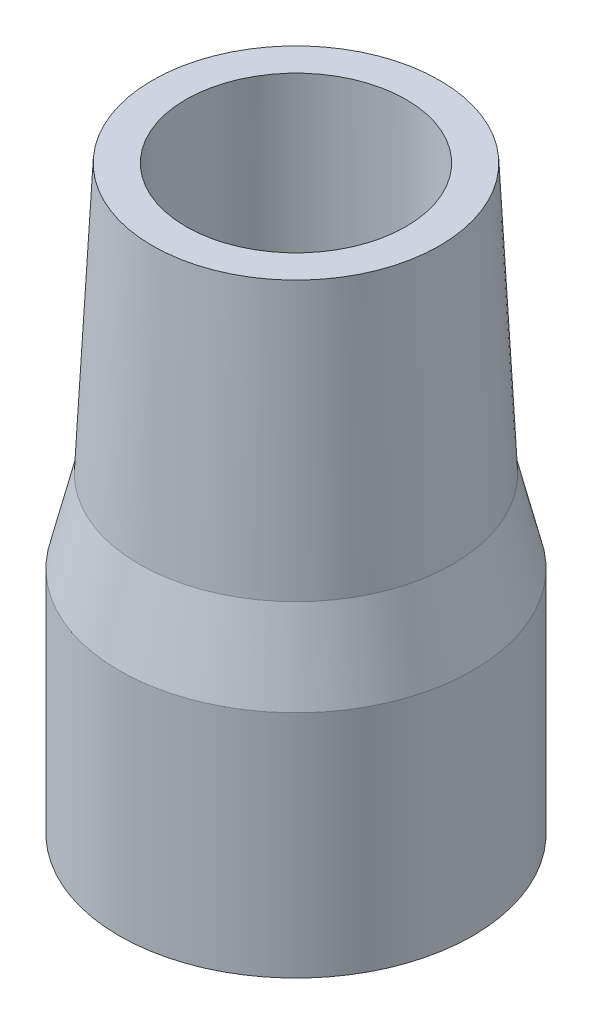
ISO-10303-21;
HEADER;
FILE_DESCRIPTION(('STEP AP214'),'2;1');
FILE_NAME('part.step','',(''),(''),'','','');
FILE_SCHEMA(('AUTOMOTIVE_DESIGN { 1 0 10303 214 1 1 1 1 }'));
ENDSEC;
DATA;
#1=APPLICATION_CONTEXT('core data for automotive mechanical design processes');
#2=APPLICATION_PROTOCOL_DEFINITION('international standard','automotive_design',2000,#1);
#3=PRODUCT_CONTEXT('',#1,'mechanical');
#4=PRODUCT('Part','Part','',(#3));
#5=PRODUCT_RELATED_PRODUCT_CATEGORY('part','',(#4));
#6=PRODUCT_DEFINITION_FORMATION('','',#4);
#7=PRODUCT_DEFINITION_CONTEXT('part definition',#1,'design');
#8=PRODUCT_DEFINITION('design','',#6,#7);
#9=PRODUCT_DEFINITION_SHAPE('','',#8);
#10=(LENGTH_UNIT() NAMED_UNIT(*) SI_UNIT(.MILLI.,.METRE.));
#11=(NAMED_UNIT(*) PLANE_ANGLE_UNIT() SI_UNIT($,.RADIAN.));
#12=(NAMED_UNIT(*) SI_UNIT($,.STERADIAN.) SOLID_ANGLE_UNIT());
#13=UNCERTAINTY_MEASURE_WITH_UNIT(LENGTH_MEASURE(1.E-05),#10,'distance_accuracy_value','');
#14=(GEOMETRIC_REPRESENTATION_CONTEXT(3) GLOBAL_UNCERTAINTY_ASSIGNED_CONTEXT((#13)) GLOBAL_UNIT_ASSIGNED_CONTEXT((#10,
#11,#12)) REPRESENTATION_CONTEXT('',''));
#15=CARTESIAN_POINT('',(0.,0.,0.));
#16=DIRECTION('',(0.,0.,1.));
#17=DIRECTION('',(1.,0.,0.));
#18=AXIS2_PLACEMENT_3D('',#15,#16,#17);
#19=CARTESIAN_POINT('',(10.25,-16.7188621181585,0.));
#20=DIRECTION('',(0.,-1.,0.));
#21=DIRECTION('',(0.,0.,-1.));
#22=AXIS2_PLACEMENT_3D('',#19,#20,#21);
#23=PLANE('',#22);
#24=CARTESIAN_POINT('',(0.,-16.7188621181585,0.));
#25=DIRECTION('',(0.,-1.,0.));
#26=DIRECTION('',(0.,0.,-1.));
#27=AXIS2_PLACEMENT_3D('',#24,#25,#26);
#28=CIRCLE('',#27,13.25);
#29=CARTESIAN_POINT('',(0.,-16.7188621181585,-13.25));
#30=VERTEX_POINT('',#29);
#31=EDGE_CURVE('E10',#30,#30,#28,.T.);
#32=ORIENTED_EDGE('',*,*,#31,.T.);
#33=EDGE_LOOP('',(#32));
#34=FACE_BOUND('',#33,.T.);
#35=CARTESIAN_POINT('',(0.,-16.7188621181585,0.));
#36=DIRECTION('',(0.,-1.,0.));
#37=DIRECTION('',(0.,0.,-1.));
#38=AXIS2_PLACEMENT_3D('',#35,#36,#37);
#39=CIRCLE('',#38,10.25);
#40=CARTESIAN_POINT('',(0.,-16.7188621181585,-10.25));
#41=VERTEX_POINT('',#40);
#42=EDGE_CURVE('E65',#41,#41,#39,.T.);
#43=ORIENTED_EDGE('',*,*,#42,.F.);
#44=EDGE_LOOP('',(#43));
#45=FACE_BOUND('',#44,.T.);
#46=ADVANCED_FACE('F31',(#34,#45),#23,.T.);
#47=CARTESIAN_POINT('',(0.,0.,0.));
#48=DIRECTION('',(0.,-1.,0.));
#49=DIRECTION('',(0.,0.,-1.));
#50=AXIS2_PLACEMENT_3D('',#47,#48,#49);
#51=CYLINDRICAL_SURFACE('',#50,13.25);
#52=CARTESIAN_POINT('',(0.,0.499962164423475,0.));
#53=DIRECTION('',(0.,-1.,0.));
#54=DIRECTION('',(0.,0.,-1.));
#55=AXIS2_PLACEMENT_3D('',#52,#53,#54);
#56=CIRCLE('',#55,13.25);
#57=CARTESIAN_POINT('',(0.,0.499962164423475,-13.25));
#58=VERTEX_POINT('',#57);
#59=EDGE_CURVE('E37',#58,#58,#56,.T.);
#60=ORIENTED_EDGE('',*,*,#59,.T.);
#61=EDGE_LOOP('',(#60));
#62=FACE_BOUND('',#61,.T.);
#63=ORIENTED_EDGE('',*,*,#31,.F.);
#64=EDGE_LOOP('',(#63));
#65=FACE_BOUND('',#64,.T.);
#66=ADVANCED_FACE('F73',(#62,#65),#51,.T.);
#67=CARTESIAN_POINT('',(0.,0.499962164423475,0.));
#68=DIRECTION('',(0.,-1.,0.));
#69=DIRECTION('',(0.,0.,-1.));
#70=AXIS2_PLACEMENT_3D('',#67,#68,#69);
#71=CONICAL_SURFACE('',#70,13.25,0.239358919330739);
#72=CARTESIAN_POINT('',(0.,6.6465626021171,0.));
#73=DIRECTION('',(0.,-1.,0.));
#74=DIRECTION('',(0.,0.,-1.));
#75=AXIS2_PLACEMENT_3D('',#72,#73,#74);
#76=CIRCLE('',#75,11.75);
#77=CARTESIAN_POINT('',(0.,6.6465626021171,-11.75));
#78=VERTEX_POINT('',#77);
#79=EDGE_CURVE('E41',#78,#78,#76,.T.);
#80=ORIENTED_EDGE('',*,*,#79,.T.);
#81=EDGE_LOOP('',(#80));
#82=FACE_BOUND('',#81,.T.);
#83=ORIENTED_EDGE('',*,*,#59,.F.);
#84=EDGE_LOOP('',(#83));
#85=FACE_BOUND('',#84,.T.);
#86=ADVANCED_FACE('F77',(#82,#85),#71,.T.);
#87=CARTESIAN_POINT('',(0.,6.6465626021171,0.));
#88=DIRECTION('',(0.,-1.,0.));
#89=DIRECTION('',(0.,0.,-1.));
#90=AXIS2_PLACEMENT_3D('',#87,#88,#89);
#91=CONICAL_SURFACE('',#90,11.75,0.0495574990959468);
#92=CARTESIAN_POINT('',(0.,26.8086215354149,0.));
#93=DIRECTION('',(0.,-1.,0.));
#94=DIRECTION('',(0.,0.,-1.));
#95=AXIS2_PLACEMENT_3D('',#92,#93,#94);
#96=CIRCLE('',#95,10.75);
#97=CARTESIAN_POINT('',(0.,26.8086215354149,-10.75));
#98=VERTEX_POINT('',#97);
#99=EDGE_CURVE('E45',#98,#98,#96,.T.);
#100=ORIENTED_EDGE('',*,*,#99,.T.);
#101=EDGE_LOOP('',(#100));
#102=FACE_BOUND('',#101,.T.);
#103=ORIENTED_EDGE('',*,*,#79,.F.);
#104=EDGE_LOOP('',(#103));
#105=FACE_BOUND('',#104,.T.);
#106=ADVANCED_FACE('F81',(#102,#105),#91,.T.);
#107=CARTESIAN_POINT('',(10.75,26.8086215354149,0.));
#108=DIRECTION('',(0.,1.,0.));
#109=DIRECTION('',(0.,0.,1.));
#110=AXIS2_PLACEMENT_3D('',#107,#108,#109);
#111=PLANE('',#110);
#112=CARTESIAN_POINT('',(0.,26.8086215354149,0.));
#113=DIRECTION('',(0.,-1.,0.));
#114=DIRECTION('',(0.,0.,-1.));
#115=AXIS2_PLACEMENT_3D('',#112,#113,#114);
#116=CIRCLE('',#115,8.25);
#117=CARTESIAN_POINT('',(0.,26.8086215354149,-8.25));
#118=VERTEX_POINT('',#117);
#119=EDGE_CURVE('E50',#118,#118,#116,.T.);
#120=ORIENTED_EDGE('',*,*,#119,.T.);
#121=EDGE_LOOP('',(#120));
#122=FACE_BOUND('',#121,.T.);
#123=ORIENTED_EDGE('',*,*,#99,.F.);
#124=EDGE_LOOP('',(#123));
#125=FACE_BOUND('',#124,.T.);
#126=ADVANCED_FACE('F88',(#122,#125),#111,.T.);
#127=CARTESIAN_POINT('',(0.,26.8086215354149,0.));
#128=DIRECTION('',(0.,-1.,0.));
#129=DIRECTION('',(0.,0.,-1.));
#130=AXIS2_PLACEMENT_3D('',#127,#128,#129);
#131=CONICAL_SURFACE('',#130,8.25,0.00215737252123881);
#132=CARTESIAN_POINT('',(0.,6.80862153541488,0.));
#133=DIRECTION('',(0.,-1.,0.));
#134=DIRECTION('',(0.,0.,-1.));
#135=AXIS2_PLACEMENT_3D('',#132,#133,#134);
#136=CIRCLE('',#135,8.29314751736466);
#137=CARTESIAN_POINT('',(0.,6.80862153541488,-8.29314751736466));
#138=VERTEX_POINT('',#137);
#139=EDGE_CURVE('E53',#138,#138,#136,.T.);
#140=ORIENTED_EDGE('',*,*,#139,.T.);
#141=EDGE_LOOP('',(#140));
#142=FACE_BOUND('',#141,.T.);
#143=ORIENTED_EDGE('',*,*,#119,.F.);
#144=EDGE_LOOP('',(#143));
#145=FACE_BOUND('',#144,.T.);
#146=ADVANCED_FACE('F92',(#142,#145),#131,.F.);
#147=CARTESIAN_POINT('',(0.,0.,0.));
#148=DIRECTION('',(0.,-1.,0.));
#149=DIRECTION('',(0.,0.,-1.));
#150=AXIS2_PLACEMENT_3D('',#147,#148,#149);
#151=CYLINDRICAL_SURFACE('',#150,8.29314751736466);
#152=CARTESIAN_POINT('',(0.,3.80862153541488,0.));
#153=DIRECTION('',(0.,-1.,0.));
#154=DIRECTION('',(0.,0.,-1.));
#155=AXIS2_PLACEMENT_3D('',#152,#153,#154);
#156=CIRCLE('',#155,8.29314751736466);
#157=CARTESIAN_POINT('',(0.,3.80862153541488,-8.29314751736466));
#158=VERTEX_POINT('',#157);
#159=EDGE_CURVE('E56',#158,#158,#156,.T.);
#160=ORIENTED_EDGE('',*,*,#159,.T.);
#161=EDGE_LOOP('',(#160));
#162=FACE_BOUND('',#161,.T.);
#163=ORIENTED_EDGE('',*,*,#139,.F.);
#164=EDGE_LOOP('',(#163));
#165=FACE_BOUND('',#164,.T.);
#166=ADVANCED_FACE('F96',(#162,#165),#151,.F.);
#167=CARTESIAN_POINT('',(8.29314751736466,3.80862153541488,0.));
#168=DIRECTION('',(0.,-1.,0.));
#169=DIRECTION('',(0.,0.,-1.));
#170=AXIS2_PLACEMENT_3D('',#167,#168,#169);
#171=PLANE('',#170);
#172=CARTESIAN_POINT('',(0.,3.80862153541488,0.));
#173=DIRECTION('',(0.,-1.,0.));
#174=DIRECTION('',(0.,0.,-1.));
#175=AXIS2_PLACEMENT_3D('',#172,#173,#174);
#176=CIRCLE('',#175,9.8);
#177=CARTESIAN_POINT('',(0.,3.80862153541488,-9.8));
#178=VERTEX_POINT('',#177);
#179=EDGE_CURVE('E59',#178,#178,#176,.T.);
#180=ORIENTED_EDGE('',*,*,#179,.T.);
#181=EDGE_LOOP('',(#180));
#182=FACE_BOUND('',#181,.T.);
#183=ORIENTED_EDGE('',*,*,#159,.F.);
#184=EDGE_LOOP('',(#183));
#185=FACE_BOUND('',#184,.T.);
#186=ADVANCED_FACE('F100',(#182,#185),#171,.T.);
#187=CARTESIAN_POINT('',(0.,0.,0.));
#188=DIRECTION('',(0.,-1.,0.));
#189=DIRECTION('',(0.,0.,-1.));
#190=AXIS2_PLACEMENT_3D('',#187,#188,#189);
#191=CYLINDRICAL_SURFACE('',#190,9.8);
#192=CARTESIAN_POINT('',(0.,3.28113788184155,0.));
#193=DIRECTION('',(0.,-1.,0.));
#194=DIRECTION('',(0.,0.,-1.));
#195=AXIS2_PLACEMENT_3D('',#192,#193,#194);
#196=CIRCLE('',#195,9.8);
#197=CARTESIAN_POINT('',(0.,3.28113788184155,-9.8));
#198=VERTEX_POINT('',#197);
#199=EDGE_CURVE('E62',#198,#198,#196,.T.);
#200=ORIENTED_EDGE('',*,*,#199,.T.);
#201=EDGE_LOOP('',(#200));
#202=FACE_BOUND('',#201,.T.);
#203=ORIENTED_EDGE('',*,*,#179,.F.);
#204=EDGE_LOOP('',(#203));
#205=FACE_BOUND('',#204,.T.);
#206=ADVANCED_FACE('F104',(#202,#205),#191,.F.);
#207=CARTESIAN_POINT('',(0.,3.28113788184155,0.));
#208=DIRECTION('',(0.,-1.,0.));
#209=DIRECTION('',(0.,0.,-1.));
#210=AXIS2_PLACEMENT_3D('',#207,#208,#209);
#211=CONICAL_SURFACE('',#210,9.8,0.0224962042778839);
#212=ORIENTED_EDGE('',*,*,#42,.T.);
#213=EDGE_LOOP('',(#212));
#214=FACE_BOUND('',#213,.T.);
#215=ORIENTED_EDGE('',*,*,#199,.F.);
#216=EDGE_LOOP('',(#215));
#217=FACE_BOUND('',#216,.T.);
#218=ADVANCED_FACE('F69',(#214,#217),#211,.F.);
#219=CLOSED_SHELL('',(#46,#66,#86,#106,#126,#146,#166,#186,#206,#218));
#220=MANIFOLD_SOLID_BREP('B2',#219);
#221=ADVANCED_BREP_SHAPE_REPRESENTATION('',(#18,#220),#14);
#222=SHAPE_DEFINITION_REPRESENTATION(#9,#221);
ENDSEC;
END-ISO-10303-21;
